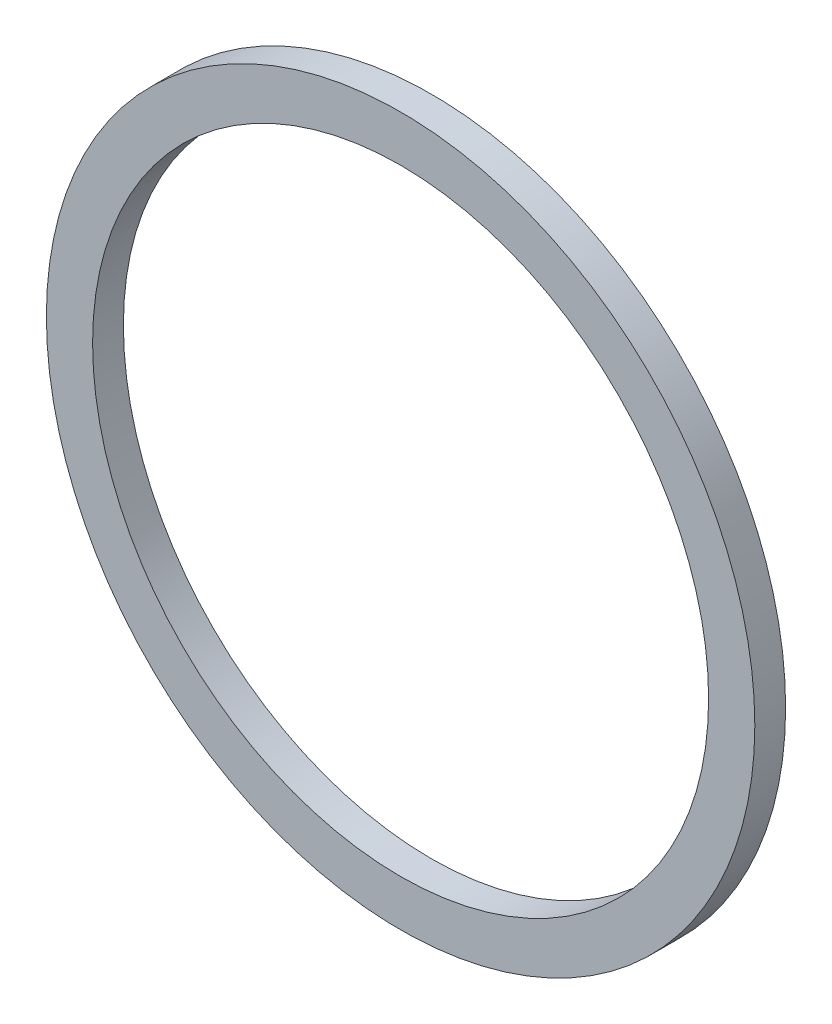
ISO-10303-21;
HEADER;
FILE_DESCRIPTION(('STEP AP214'),'2;1');
FILE_NAME('part.step','',(''),(''),'','','');
FILE_SCHEMA(('AUTOMOTIVE_DESIGN { 1 0 10303 214 1 1 1 1 }'));
ENDSEC;
DATA;
#1=APPLICATION_CONTEXT('core data for automotive mechanical design processes');
#2=APPLICATION_PROTOCOL_DEFINITION('international standard','automotive_design',2000,#1);
#3=PRODUCT_CONTEXT('',#1,'mechanical');
#4=PRODUCT('Part','Part','',(#3));
#5=PRODUCT_RELATED_PRODUCT_CATEGORY('part','',(#4));
#6=PRODUCT_DEFINITION_FORMATION('','',#4);
#7=PRODUCT_DEFINITION_CONTEXT('part definition',#1,'design');
#8=PRODUCT_DEFINITION('design','',#6,#7);
#9=PRODUCT_DEFINITION_SHAPE('','',#8);
#10=(LENGTH_UNIT() NAMED_UNIT(*) SI_UNIT(.MILLI.,.METRE.));
#11=(NAMED_UNIT(*) PLANE_ANGLE_UNIT() SI_UNIT($,.RADIAN.));
#12=(NAMED_UNIT(*) SI_UNIT($,.STERADIAN.) SOLID_ANGLE_UNIT());
#13=UNCERTAINTY_MEASURE_WITH_UNIT(LENGTH_MEASURE(1.E-05),#10,'distance_accuracy_value','');
#14=(GEOMETRIC_REPRESENTATION_CONTEXT(3) GLOBAL_UNCERTAINTY_ASSIGNED_CONTEXT((#13)) GLOBAL_UNIT_ASSIGNED_CONTEXT((#10,
#11,#12)) REPRESENTATION_CONTEXT('',''));
#15=CARTESIAN_POINT('',(0.,0.,0.));
#16=DIRECTION('',(0.,0.,1.));
#17=DIRECTION('',(1.,0.,0.));
#18=AXIS2_PLACEMENT_3D('',#15,#16,#17);
#19=CARTESIAN_POINT('',(0.,0.,10.));
#20=DIRECTION('',(0.,0.,1.));
#21=DIRECTION('',(1.,0.,0.));
#22=AXIS2_PLACEMENT_3D('',#19,#20,#21);
#23=PLANE('',#22);
#24=CARTESIAN_POINT('',(0.,0.,10.));
#25=DIRECTION('',(0.,0.,1.));
#26=DIRECTION('',(1.,0.,0.));
#27=AXIS2_PLACEMENT_3D('',#24,#25,#26);
#28=CIRCLE('',#27,115.);
#29=CARTESIAN_POINT('',(115.,0.,10.));
#30=VERTEX_POINT('',#29);
#31=EDGE_CURVE('E10',#30,#30,#28,.T.);
#32=ORIENTED_EDGE('',*,*,#31,.T.);
#33=EDGE_LOOP('',(#32));
#34=FACE_BOUND('',#33,.T.);
#35=CARTESIAN_POINT('',(0.,0.,10.));
#36=DIRECTION('',(0.,0.,1.));
#37=DIRECTION('',(1.,0.,0.));
#38=AXIS2_PLACEMENT_3D('',#35,#36,#37);
#39=CIRCLE('',#38,100.);
#40=CARTESIAN_POINT('',(100.,0.,10.));
#41=VERTEX_POINT('',#40);
#42=EDGE_CURVE('E43',#41,#41,#39,.T.);
#43=ORIENTED_EDGE('',*,*,#42,.F.);
#44=EDGE_LOOP('',(#43));
#45=FACE_BOUND('',#44,.T.);
#46=ADVANCED_FACE('F32',(#34,#45),#23,.T.);
#47=CARTESIAN_POINT('',(0.,0.,0.));
#48=DIRECTION('',(0.,0.,1.));
#49=DIRECTION('',(1.,0.,0.));
#50=AXIS2_PLACEMENT_3D('',#47,#48,#49);
#51=PLANE('',#50);
#52=CARTESIAN_POINT('',(0.,0.,0.));
#53=DIRECTION('',(0.,0.,1.));
#54=DIRECTION('',(1.,0.,0.));
#55=AXIS2_PLACEMENT_3D('',#52,#53,#54);
#56=CIRCLE('',#55,115.);
#57=CARTESIAN_POINT('',(115.,0.,0.));
#58=VERTEX_POINT('',#57);
#59=EDGE_CURVE('E36',#58,#58,#56,.T.);
#60=ORIENTED_EDGE('',*,*,#59,.F.);
#61=EDGE_LOOP('',(#60));
#62=FACE_BOUND('',#61,.T.);
#63=CARTESIAN_POINT('',(0.,0.,0.));
#64=DIRECTION('',(0.,0.,1.));
#65=DIRECTION('',(1.,0.,0.));
#66=AXIS2_PLACEMENT_3D('',#63,#64,#65);
#67=CIRCLE('',#66,100.);
#68=CARTESIAN_POINT('',(100.,0.,0.));
#69=VERTEX_POINT('',#68);
#70=EDGE_CURVE('E45',#69,#69,#67,.T.);
#71=ORIENTED_EDGE('',*,*,#70,.T.);
#72=EDGE_LOOP('',(#71));
#73=FACE_BOUND('',#72,.T.);
#74=ADVANCED_FACE('F55',(#62,#73),#51,.F.);
#75=CARTESIAN_POINT('',(0.,0.,10.));
#76=DIRECTION('',(0.,0.,-1.));
#77=DIRECTION('',(-1.,0.,0.));
#78=AXIS2_PLACEMENT_3D('',#75,#76,#77);
#79=CYLINDRICAL_SURFACE('',#78,115.);
#80=ORIENTED_EDGE('',*,*,#31,.F.);
#81=EDGE_LOOP('',(#80));
#82=FACE_BOUND('',#81,.T.);
#83=ORIENTED_EDGE('',*,*,#59,.T.);
#84=EDGE_LOOP('',(#83));
#85=FACE_BOUND('',#84,.T.);
#86=ADVANCED_FACE('F34',(#82,#85),#79,.T.);
#87=CARTESIAN_POINT('',(0.,0.,10.));
#88=DIRECTION('',(0.,0.,-1.));
#89=DIRECTION('',(-1.,0.,0.));
#90=AXIS2_PLACEMENT_3D('',#87,#88,#89);
#91=CYLINDRICAL_SURFACE('',#90,100.);
#92=ORIENTED_EDGE('',*,*,#42,.T.);
#93=EDGE_LOOP('',(#92));
#94=FACE_BOUND('',#93,.T.);
#95=ORIENTED_EDGE('',*,*,#70,.F.);
#96=EDGE_LOOP('',(#95));
#97=FACE_BOUND('',#96,.T.);
#98=ADVANCED_FACE('F51',(#94,#97),#91,.F.);
#99=CLOSED_SHELL('',(#46,#74,#86,#98));
#100=MANIFOLD_SOLID_BREP('B2',#99);
#101=ADVANCED_BREP_SHAPE_REPRESENTATION('',(#18,#100),#14);
#102=SHAPE_DEFINITION_REPRESENTATION(#9,#101);
ENDSEC;
END-ISO-10303-21;
